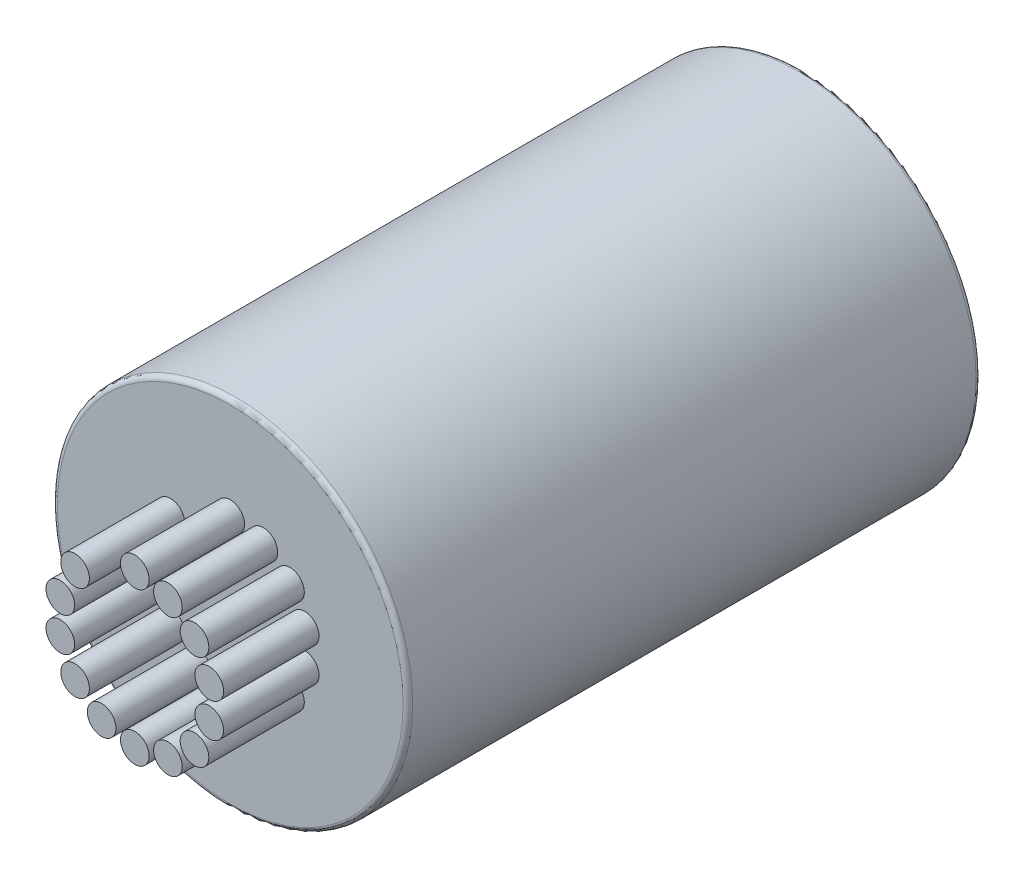
ISO-10303-21;
HEADER;
FILE_DESCRIPTION(('STEP AP214'),'2;1');
FILE_NAME('part.step','',(''),(''),'','','');
FILE_SCHEMA(('AUTOMOTIVE_DESIGN { 1 0 10303 214 1 1 1 1 }'));
ENDSEC;
DATA;
#1=APPLICATION_CONTEXT('core data for automotive mechanical design processes');
#2=APPLICATION_PROTOCOL_DEFINITION('international standard','automotive_design',2000,#1);
#3=PRODUCT_CONTEXT('',#1,'mechanical');
#4=PRODUCT('Part','Part','',(#3));
#5=PRODUCT_RELATED_PRODUCT_CATEGORY('part','',(#4));
#6=PRODUCT_DEFINITION_FORMATION('','',#4);
#7=PRODUCT_DEFINITION_CONTEXT('part definition',#1,'design');
#8=PRODUCT_DEFINITION('design','',#6,#7);
#9=PRODUCT_DEFINITION_SHAPE('','',#8);
#10=(LENGTH_UNIT() NAMED_UNIT(*) SI_UNIT(.MILLI.,.METRE.));
#11=(NAMED_UNIT(*) PLANE_ANGLE_UNIT() SI_UNIT($,.RADIAN.));
#12=(NAMED_UNIT(*) SI_UNIT($,.STERADIAN.) SOLID_ANGLE_UNIT());
#13=UNCERTAINTY_MEASURE_WITH_UNIT(LENGTH_MEASURE(1.E-05),#10,'distance_accuracy_value','');
#14=(GEOMETRIC_REPRESENTATION_CONTEXT(3) GLOBAL_UNCERTAINTY_ASSIGNED_CONTEXT((#13)) GLOBAL_UNIT_ASSIGNED_CONTEXT((#10,
#11,#12)) REPRESENTATION_CONTEXT('',''));
#15=CARTESIAN_POINT('',(0.,0.,0.));
#16=DIRECTION('',(0.,0.,1.));
#17=DIRECTION('',(1.,0.,0.));
#18=AXIS2_PLACEMENT_3D('',#15,#16,#17);
#19=CARTESIAN_POINT('',(0.,0.,30.));
#20=DIRECTION('',(0.,0.,-1.));
#21=DIRECTION('',(-1.,0.,0.));
#22=AXIS2_PLACEMENT_3D('',#19,#20,#21);
#23=CYLINDRICAL_SURFACE('',#22,9.3);
#24=CARTESIAN_POINT('',(0.,0.,29.75));
#25=DIRECTION('',(0.,0.,1.));
#26=DIRECTION('',(1.,0.,0.));
#27=AXIS2_PLACEMENT_3D('',#24,#25,#26);
#28=CIRCLE('',#27,9.3);
#29=CARTESIAN_POINT('',(9.3,0.,29.75));
#30=VERTEX_POINT('',#29);
#31=EDGE_CURVE('E39',#30,#30,#28,.F.);
#32=ORIENTED_EDGE('',*,*,#31,.T.);
#33=EDGE_LOOP('',(#32));
#34=FACE_BOUND('',#33,.T.);
#35=CARTESIAN_POINT('',(0.,0.,0.25));
#36=DIRECTION('',(0.,0.,1.));
#37=DIRECTION('',(1.,0.,0.));
#38=AXIS2_PLACEMENT_3D('',#35,#36,#37);
#39=CIRCLE('',#38,9.3);
#40=CARTESIAN_POINT('',(9.3,0.,0.25));
#41=VERTEX_POINT('',#40);
#42=EDGE_CURVE('E43',#41,#41,#39,.T.);
#43=ORIENTED_EDGE('',*,*,#42,.T.);
#44=EDGE_LOOP('',(#43));
#45=FACE_BOUND('',#44,.T.);
#46=ADVANCED_FACE('F32',(#34,#45),#23,.T.);
#47=CARTESIAN_POINT('',(0.,0.,30.));
#48=DIRECTION('',(0.,0.,1.));
#49=DIRECTION('',(1.,0.,0.));
#50=AXIS2_PLACEMENT_3D('',#47,#48,#49);
#51=PLANE('',#50);
#52=CARTESIAN_POINT('',(0.,0.,30.));
#53=DIRECTION('',(0.,0.,1.));
#54=DIRECTION('',(1.,0.,0.));
#55=AXIS2_PLACEMENT_3D('',#52,#53,#54);
#56=CIRCLE('',#55,9.05);
#57=CARTESIAN_POINT('',(9.05,0.,30.));
#58=VERTEX_POINT('',#57);
#59=EDGE_CURVE('E47',#58,#58,#56,.T.);
#60=ORIENTED_EDGE('',*,*,#59,.T.);
#61=EDGE_LOOP('',(#60));
#62=FACE_BOUND('',#61,.T.);
#63=CARTESIAN_POINT('',(-3.12732592987195,2.49395920743501,30.));
#64=DIRECTION('',(0.,0.,1.));
#65=DIRECTION('',(1.,0.,0.));
#66=AXIS2_PLACEMENT_3D('',#63,#64,#65);
#67=CIRCLE('',#66,0.750000000000115);
#68=CARTESIAN_POINT('',(-2.37732592987183,2.49395920743501,30.));
#69=VERTEX_POINT('',#68);
#70=EDGE_CURVE('E131',#69,#69,#67,.T.);
#71=ORIENTED_EDGE('',*,*,#70,.F.);
#72=EDGE_LOOP('',(#71));
#73=FACE_BOUND('',#72,.T.);
#74=CARTESIAN_POINT('',(-3.89971164872716,0.890083735825348,30.));
#75=DIRECTION('',(0.,0.,1.));
#76=DIRECTION('',(1.,0.,0.));
#77=AXIS2_PLACEMENT_3D('',#74,#75,#76);
#78=CIRCLE('',#77,0.750000000000158);
#79=CARTESIAN_POINT('',(-3.149711648727,0.890083735825348,30.));
#80=VERTEX_POINT('',#79);
#81=EDGE_CURVE('E125',#80,#80,#78,.T.);
#82=ORIENTED_EDGE('',*,*,#81,.F.);
#83=EDGE_LOOP('',(#82));
#84=FACE_BOUND('',#83,.T.);
#85=CARTESIAN_POINT('',(-3.8997116487272,-0.890083735825168,30.));
#86=DIRECTION('',(0.,0.,1.));
#87=DIRECTION('',(1.,0.,0.));
#88=AXIS2_PLACEMENT_3D('',#85,#86,#87);
#89=CIRCLE('',#88,0.750000000000203);
#90=CARTESIAN_POINT('',(-3.149711648727,-0.890083735825168,30.));
#91=VERTEX_POINT('',#90);
#92=EDGE_CURVE('E119',#91,#91,#89,.T.);
#93=ORIENTED_EDGE('',*,*,#92,.F.);
#94=EDGE_LOOP('',(#93));
#95=FACE_BOUND('',#94,.T.);
#96=CARTESIAN_POINT('',(-3.12732592987206,-2.49395920743486,30.));
#97=DIRECTION('',(0.,0.,1.));
#98=DIRECTION('',(1.,0.,0.));
#99=AXIS2_PLACEMENT_3D('',#96,#97,#98);
#100=CIRCLE('',#99,0.750000000000238);
#101=CARTESIAN_POINT('',(-2.37732592987182,-2.49395920743486,30.));
#102=VERTEX_POINT('',#101);
#103=EDGE_CURVE('E113',#102,#102,#100,.T.);
#104=ORIENTED_EDGE('',*,*,#103,.F.);
#105=EDGE_LOOP('',(#104));
#106=FACE_BOUND('',#105,.T.);
#107=CARTESIAN_POINT('',(-1.7355349564702,-3.60387547160964,30.));
#108=DIRECTION('',(0.,0.,1.));
#109=DIRECTION('',(1.,0.,0.));
#110=AXIS2_PLACEMENT_3D('',#107,#108,#109);
#111=CIRCLE('',#110,0.750000000000253);
#112=CARTESIAN_POINT('',(-0.985534956469948,-3.60387547160964,30.));
#113=VERTEX_POINT('',#112);
#114=EDGE_CURVE('E107',#113,#113,#111,.T.);
#115=ORIENTED_EDGE('',*,*,#114,.F.);
#116=EDGE_LOOP('',(#115));
#117=FACE_BOUND('',#116,.T.);
#118=CARTESIAN_POINT('',(0.,-4.,30.));
#119=DIRECTION('',(0.,0.,1.));
#120=DIRECTION('',(1.,0.,0.));
#121=AXIS2_PLACEMENT_3D('',#118,#119,#120);
#122=CIRCLE('',#121,0.750000000000246);
#123=CARTESIAN_POINT('',(0.750000000000268,-4.,30.));
#124=VERTEX_POINT('',#123);
#125=EDGE_CURVE('E101',#124,#124,#122,.T.);
#126=ORIENTED_EDGE('',*,*,#125,.F.);
#127=EDGE_LOOP('',(#126));
#128=FACE_BOUND('',#127,.T.);
#129=CARTESIAN_POINT('',(1.73553495647026,-3.60387547160972,30.));
#130=DIRECTION('',(0.,0.,1.));
#131=DIRECTION('',(1.,0.,0.));
#132=AXIS2_PLACEMENT_3D('',#129,#130,#131);
#133=CIRCLE('',#132,0.750000000000218);
#134=CARTESIAN_POINT('',(2.48553495647048,-3.60387547160972,30.));
#135=VERTEX_POINT('',#134);
#136=EDGE_CURVE('E95',#135,#135,#133,.T.);
#137=ORIENTED_EDGE('',*,*,#136,.F.);
#138=EDGE_LOOP('',(#137));
#139=FACE_BOUND('',#138,.T.);
#140=CARTESIAN_POINT('',(3.12732592987218,-2.49395920743501,30.));
#141=DIRECTION('',(0.,0.,1.));
#142=DIRECTION('',(1.,0.,0.));
#143=AXIS2_PLACEMENT_3D('',#140,#141,#142);
#144=CIRCLE('',#143,0.75000000000017);
#145=CARTESIAN_POINT('',(3.87732592987235,-2.49395920743501,30.));
#146=VERTEX_POINT('',#145);
#147=EDGE_CURVE('E89',#146,#146,#144,.T.);
#148=ORIENTED_EDGE('',*,*,#147,.F.);
#149=EDGE_LOOP('',(#148));
#150=FACE_BOUND('',#149,.T.);
#151=CARTESIAN_POINT('',(3.89971164872739,-0.890083735825348,30.));
#152=DIRECTION('',(0.,0.,1.));
#153=DIRECTION('',(1.,0.,0.));
#154=AXIS2_PLACEMENT_3D('',#151,#152,#153);
#155=CIRCLE('',#154,0.750000000000117);
#156=CARTESIAN_POINT('',(4.64971164872751,-0.890083735825348,30.));
#157=VERTEX_POINT('',#156);
#158=EDGE_CURVE('E83',#157,#157,#155,.T.);
#159=ORIENTED_EDGE('',*,*,#158,.F.);
#160=EDGE_LOOP('',(#159));
#161=FACE_BOUND('',#160,.T.);
#162=CARTESIAN_POINT('',(3.89971164872743,0.890083735825167,30.));
#163=DIRECTION('',(0.,0.,1.));
#164=DIRECTION('',(1.,0.,0.));
#165=AXIS2_PLACEMENT_3D('',#162,#163,#164);
#166=CIRCLE('',#165,0.750000000000064);
#167=CARTESIAN_POINT('',(4.64971164872749,0.890083735825167,30.));
#168=VERTEX_POINT('',#167);
#169=EDGE_CURVE('E77',#168,#168,#166,.T.);
#170=ORIENTED_EDGE('',*,*,#169,.F.);
#171=EDGE_LOOP('',(#170));
#172=FACE_BOUND('',#171,.T.);
#173=CARTESIAN_POINT('',(3.12732592987225,2.49395920743477,30.));
#174=DIRECTION('',(0.,0.,1.));
#175=DIRECTION('',(1.,0.,0.));
#176=AXIS2_PLACEMENT_3D('',#173,#174,#175);
#177=CIRCLE('',#176,0.75);
#178=CARTESIAN_POINT('',(3.87732592987225,2.49395920743477,30.));
#179=VERTEX_POINT('',#178);
#180=EDGE_CURVE('E71',#179,#179,#177,.T.);
#181=ORIENTED_EDGE('',*,*,#180,.F.);
#182=EDGE_LOOP('',(#181));
#183=FACE_BOUND('',#182,.T.);
#184=CARTESIAN_POINT('',(1.73553495647042,3.60387547160959,30.));
#185=DIRECTION('',(0.,0.,1.));
#186=DIRECTION('',(1.,0.,0.));
#187=AXIS2_PLACEMENT_3D('',#184,#185,#186);
#188=CIRCLE('',#187,0.75);
#189=CARTESIAN_POINT('',(2.48553495647042,3.60387547160959,30.));
#190=VERTEX_POINT('',#189);
#191=EDGE_CURVE('E65',#190,#190,#188,.T.);
#192=ORIENTED_EDGE('',*,*,#191,.F.);
#193=EDGE_LOOP('',(#192));
#194=FACE_BOUND('',#193,.T.);
#195=CARTESIAN_POINT('',(2.07662222155635E-13,4.,30.));
#196=DIRECTION('',(0.,0.,1.));
#197=DIRECTION('',(1.,0.,0.));
#198=AXIS2_PLACEMENT_3D('',#195,#196,#197);
#199=CIRCLE('',#198,0.75);
#200=CARTESIAN_POINT('',(0.750000000000208,4.,30.));
#201=VERTEX_POINT('',#200);
#202=EDGE_CURVE('E59',#201,#201,#199,.T.);
#203=ORIENTED_EDGE('',*,*,#202,.F.);
#204=EDGE_LOOP('',(#203));
#205=FACE_BOUND('',#204,.T.);
#206=ADVANCED_FACE('F146',(#62,#73,#84,#95,#106,#117,#128,#139,#150,#161,#172,#183,#194,#205),
#51,.T.);
#207=CARTESIAN_POINT('',(0.,0.,0.));
#208=DIRECTION('',(0.,0.,1.));
#209=DIRECTION('',(1.,0.,0.));
#210=AXIS2_PLACEMENT_3D('',#207,#208,#209);
#211=PLANE('',#210);
#212=CARTESIAN_POINT('',(0.,0.,0.));
#213=DIRECTION('',(0.,0.,1.));
#214=DIRECTION('',(1.,0.,0.));
#215=AXIS2_PLACEMENT_3D('',#212,#213,#214);
#216=CIRCLE('',#215,9.05);
#217=CARTESIAN_POINT('',(9.05,0.,0.));
#218=VERTEX_POINT('',#217);
#219=EDGE_CURVE('E10',#218,#218,#216,.F.);
#220=ORIENTED_EDGE('',*,*,#219,.T.);
#221=EDGE_LOOP('',(#220));
#222=FACE_BOUND('',#221,.T.);
#223=CARTESIAN_POINT('',(0.,0.,0.));
#224=DIRECTION('',(0.,0.,-1.));
#225=DIRECTION('',(-1.,0.,0.));
#226=AXIS2_PLACEMENT_3D('',#223,#224,#225);
#227=CIRCLE('',#226,7.5);
#228=CARTESIAN_POINT('',(-7.5,0.,0.));
#229=VERTEX_POINT('',#228);
#230=EDGE_CURVE('E53',#229,#229,#227,.T.);
#231=ORIENTED_EDGE('',*,*,#230,.F.);
#232=EDGE_LOOP('',(#231));
#233=FACE_BOUND('',#232,.T.);
#234=ADVANCED_FACE('F149',(#222,#233),#211,.F.);
#235=CARTESIAN_POINT('',(0.,0.,0.1));
#236=DIRECTION('',(0.,0.,-1.));
#237=DIRECTION('',(-1.,0.,0.));
#238=AXIS2_PLACEMENT_3D('',#235,#236,#237);
#239=CYLINDRICAL_SURFACE('',#238,7.5);
#240=CARTESIAN_POINT('',(0.,0.,0.1));
#241=DIRECTION('',(0.,0.,-1.));
#242=DIRECTION('',(-1.,0.,0.));
#243=AXIS2_PLACEMENT_3D('',#240,#241,#242);
#244=CIRCLE('',#243,7.5);
#245=CARTESIAN_POINT('',(-7.5,0.,0.1));
#246=VERTEX_POINT('',#245);
#247=EDGE_CURVE('E52',#246,#246,#244,.T.);
#248=ORIENTED_EDGE('',*,*,#247,.F.);
#249=EDGE_LOOP('',(#248));
#250=FACE_BOUND('',#249,.T.);
#251=ORIENTED_EDGE('',*,*,#230,.T.);
#252=EDGE_LOOP('',(#251));
#253=FACE_BOUND('',#252,.T.);
#254=ADVANCED_FACE('F189',(#250,#253),#239,.F.);
#255=CARTESIAN_POINT('',(0.,0.,0.1));
#256=DIRECTION('',(0.,0.,-1.));
#257=DIRECTION('',(-1.,0.,0.));
#258=AXIS2_PLACEMENT_3D('',#255,#256,#257);
#259=PLANE('',#258);
#260=ORIENTED_EDGE('',*,*,#247,.T.);
#261=EDGE_LOOP('',(#260));
#262=FACE_BOUND('',#261,.T.);
#263=ADVANCED_FACE('F179',(#262),#259,.T.);
#264=CARTESIAN_POINT('',(2.07662222155635E-13,4.,35.));
#265=DIRECTION('',(0.,0.,-1.));
#266=DIRECTION('',(-1.,0.,0.));
#267=AXIS2_PLACEMENT_3D('',#264,#265,#266);
#268=CYLINDRICAL_SURFACE('',#267,0.75);
#269=CARTESIAN_POINT('',(2.07662222155635E-13,4.,35.));
#270=DIRECTION('',(0.,0.,1.));
#271=DIRECTION('',(1.,0.,0.));
#272=AXIS2_PLACEMENT_3D('',#269,#270,#271);
#273=CIRCLE('',#272,0.75);
#274=CARTESIAN_POINT('',(0.750000000000208,4.,35.));
#275=VERTEX_POINT('',#274);
#276=EDGE_CURVE('E56',#275,#275,#273,.T.);
#277=ORIENTED_EDGE('',*,*,#276,.F.);
#278=EDGE_LOOP('',(#277));
#279=FACE_BOUND('',#278,.T.);
#280=ORIENTED_EDGE('',*,*,#202,.T.);
#281=EDGE_LOOP('',(#280));
#282=FACE_BOUND('',#281,.T.);
#283=ADVANCED_FACE('F176',(#279,#282),#268,.T.);
#284=CARTESIAN_POINT('',(2.07662222155635E-13,4.,35.));
#285=DIRECTION('',(0.,0.,1.));
#286=DIRECTION('',(1.,0.,0.));
#287=AXIS2_PLACEMENT_3D('',#284,#285,#286);
#288=PLANE('',#287);
#289=ORIENTED_EDGE('',*,*,#276,.T.);
#290=EDGE_LOOP('',(#289));
#291=FACE_BOUND('',#290,.T.);
#292=ADVANCED_FACE('F178',(#291),#288,.T.);
#293=CARTESIAN_POINT('',(1.73553495647042,3.60387547160959,35.));
#294=DIRECTION('',(0.,0.,-1.));
#295=DIRECTION('',(-1.,0.,0.));
#296=AXIS2_PLACEMENT_3D('',#293,#294,#295);
#297=CYLINDRICAL_SURFACE('',#296,0.75);
#298=CARTESIAN_POINT('',(1.73553495647042,3.60387547160959,35.));
#299=DIRECTION('',(0.,0.,1.));
#300=DIRECTION('',(1.,0.,0.));
#301=AXIS2_PLACEMENT_3D('',#298,#299,#300);
#302=CIRCLE('',#301,0.75);
#303=CARTESIAN_POINT('',(2.48553495647042,3.60387547160959,35.));
#304=VERTEX_POINT('',#303);
#305=EDGE_CURVE('E62',#304,#304,#302,.T.);
#306=ORIENTED_EDGE('',*,*,#305,.F.);
#307=EDGE_LOOP('',(#306));
#308=FACE_BOUND('',#307,.T.);
#309=ORIENTED_EDGE('',*,*,#191,.T.);
#310=EDGE_LOOP('',(#309));
#311=FACE_BOUND('',#310,.T.);
#312=ADVANCED_FACE('F186',(#308,#311),#297,.T.);
#313=CARTESIAN_POINT('',(1.73553495647042,3.60387547160959,35.));
#314=DIRECTION('',(0.,0.,1.));
#315=DIRECTION('',(1.,0.,0.));
#316=AXIS2_PLACEMENT_3D('',#313,#314,#315);
#317=PLANE('',#316);
#318=ORIENTED_EDGE('',*,*,#305,.T.);
#319=EDGE_LOOP('',(#318));
#320=FACE_BOUND('',#319,.T.);
#321=ADVANCED_FACE('F291',(#320),#317,.T.);
#322=CARTESIAN_POINT('',(3.12732592987225,2.49395920743477,35.));
#323=DIRECTION('',(0.,0.,-1.));
#324=DIRECTION('',(-1.,0.,0.));
#325=AXIS2_PLACEMENT_3D('',#322,#323,#324);
#326=CYLINDRICAL_SURFACE('',#325,0.75);
#327=CARTESIAN_POINT('',(3.12732592987225,2.49395920743477,35.));
#328=DIRECTION('',(0.,0.,1.));
#329=DIRECTION('',(1.,0.,0.));
#330=AXIS2_PLACEMENT_3D('',#327,#328,#329);
#331=CIRCLE('',#330,0.75);
#332=CARTESIAN_POINT('',(3.87732592987225,2.49395920743477,35.));
#333=VERTEX_POINT('',#332);
#334=EDGE_CURVE('E68',#333,#333,#331,.T.);
#335=ORIENTED_EDGE('',*,*,#334,.F.);
#336=EDGE_LOOP('',(#335));
#337=FACE_BOUND('',#336,.T.);
#338=ORIENTED_EDGE('',*,*,#180,.T.);
#339=EDGE_LOOP('',(#338));
#340=FACE_BOUND('',#339,.T.);
#341=ADVANCED_FACE('F287',(#337,#340),#326,.T.);
#342=CARTESIAN_POINT('',(3.12732592987225,2.49395920743477,35.));
#343=DIRECTION('',(0.,0.,1.));
#344=DIRECTION('',(1.,0.,0.));
#345=AXIS2_PLACEMENT_3D('',#342,#343,#344);
#346=PLANE('',#345);
#347=ORIENTED_EDGE('',*,*,#334,.T.);
#348=EDGE_LOOP('',(#347));
#349=FACE_BOUND('',#348,.T.);
#350=ADVANCED_FACE('F283',(#349),#346,.T.);
#351=CARTESIAN_POINT('',(3.89971164872743,0.890083735825167,35.));
#352=DIRECTION('',(0.,0.,-1.));
#353=DIRECTION('',(-1.,0.,0.));
#354=AXIS2_PLACEMENT_3D('',#351,#352,#353);
#355=CYLINDRICAL_SURFACE('',#354,0.750000000000064);
#356=CARTESIAN_POINT('',(3.89971164872743,0.890083735825167,35.));
#357=DIRECTION('',(0.,0.,1.));
#358=DIRECTION('',(1.,0.,0.));
#359=AXIS2_PLACEMENT_3D('',#356,#357,#358);
#360=CIRCLE('',#359,0.750000000000064);
#361=CARTESIAN_POINT('',(4.64971164872749,0.890083735825167,35.));
#362=VERTEX_POINT('',#361);
#363=EDGE_CURVE('E74',#362,#362,#360,.T.);
#364=ORIENTED_EDGE('',*,*,#363,.F.);
#365=EDGE_LOOP('',(#364));
#366=FACE_BOUND('',#365,.T.);
#367=ORIENTED_EDGE('',*,*,#169,.T.);
#368=EDGE_LOOP('',(#367));
#369=FACE_BOUND('',#368,.T.);
#370=ADVANCED_FACE('F279',(#366,#369),#355,.T.);
#371=CARTESIAN_POINT('',(3.89971164872743,0.890083735825167,35.));
#372=DIRECTION('',(0.,0.,1.));
#373=DIRECTION('',(1.,0.,0.));
#374=AXIS2_PLACEMENT_3D('',#371,#372,#373);
#375=PLANE('',#374);
#376=ORIENTED_EDGE('',*,*,#363,.T.);
#377=EDGE_LOOP('',(#376));
#378=FACE_BOUND('',#377,.T.);
#379=ADVANCED_FACE('F275',(#378),#375,.T.);
#380=CARTESIAN_POINT('',(3.89971164872739,-0.890083735825348,35.));
#381=DIRECTION('',(0.,0.,-1.));
#382=DIRECTION('',(-1.,0.,0.));
#383=AXIS2_PLACEMENT_3D('',#380,#381,#382);
#384=CYLINDRICAL_SURFACE('',#383,0.750000000000117);
#385=CARTESIAN_POINT('',(3.89971164872739,-0.890083735825348,35.));
#386=DIRECTION('',(0.,0.,1.));
#387=DIRECTION('',(1.,0.,0.));
#388=AXIS2_PLACEMENT_3D('',#385,#386,#387);
#389=CIRCLE('',#388,0.750000000000117);
#390=CARTESIAN_POINT('',(4.64971164872751,-0.890083735825348,35.));
#391=VERTEX_POINT('',#390);
#392=EDGE_CURVE('E80',#391,#391,#389,.T.);
#393=ORIENTED_EDGE('',*,*,#392,.F.);
#394=EDGE_LOOP('',(#393));
#395=FACE_BOUND('',#394,.T.);
#396=ORIENTED_EDGE('',*,*,#158,.T.);
#397=EDGE_LOOP('',(#396));
#398=FACE_BOUND('',#397,.T.);
#399=ADVANCED_FACE('F271',(#395,#398),#384,.T.);
#400=CARTESIAN_POINT('',(3.89971164872739,-0.890083735825348,35.));
#401=DIRECTION('',(0.,0.,1.));
#402=DIRECTION('',(1.,0.,0.));
#403=AXIS2_PLACEMENT_3D('',#400,#401,#402);
#404=PLANE('',#403);
#405=ORIENTED_EDGE('',*,*,#392,.T.);
#406=EDGE_LOOP('',(#405));
#407=FACE_BOUND('',#406,.T.);
#408=ADVANCED_FACE('F267',(#407),#404,.T.);
#409=CARTESIAN_POINT('',(3.12732592987218,-2.49395920743501,35.));
#410=DIRECTION('',(0.,0.,-1.));
#411=DIRECTION('',(-1.,0.,0.));
#412=AXIS2_PLACEMENT_3D('',#409,#410,#411);
#413=CYLINDRICAL_SURFACE('',#412,0.75000000000017);
#414=CARTESIAN_POINT('',(3.12732592987218,-2.49395920743501,35.));
#415=DIRECTION('',(0.,0.,1.));
#416=DIRECTION('',(1.,0.,0.));
#417=AXIS2_PLACEMENT_3D('',#414,#415,#416);
#418=CIRCLE('',#417,0.75000000000017);
#419=CARTESIAN_POINT('',(3.87732592987235,-2.49395920743501,35.));
#420=VERTEX_POINT('',#419);
#421=EDGE_CURVE('E86',#420,#420,#418,.T.);
#422=ORIENTED_EDGE('',*,*,#421,.F.);
#423=EDGE_LOOP('',(#422));
#424=FACE_BOUND('',#423,.T.);
#425=ORIENTED_EDGE('',*,*,#147,.T.);
#426=EDGE_LOOP('',(#425));
#427=FACE_BOUND('',#426,.T.);
#428=ADVANCED_FACE('F263',(#424,#427),#413,.T.);
#429=CARTESIAN_POINT('',(3.12732592987218,-2.49395920743501,35.));
#430=DIRECTION('',(0.,0.,1.));
#431=DIRECTION('',(1.,0.,0.));
#432=AXIS2_PLACEMENT_3D('',#429,#430,#431);
#433=PLANE('',#432);
#434=ORIENTED_EDGE('',*,*,#421,.T.);
#435=EDGE_LOOP('',(#434));
#436=FACE_BOUND('',#435,.T.);
#437=ADVANCED_FACE('F259',(#436),#433,.T.);
#438=CARTESIAN_POINT('',(1.73553495647026,-3.60387547160972,35.));
#439=DIRECTION('',(0.,0.,-1.));
#440=DIRECTION('',(-1.,0.,0.));
#441=AXIS2_PLACEMENT_3D('',#438,#439,#440);
#442=CYLINDRICAL_SURFACE('',#441,0.750000000000218);
#443=CARTESIAN_POINT('',(1.73553495647026,-3.60387547160972,35.));
#444=DIRECTION('',(0.,0.,1.));
#445=DIRECTION('',(1.,0.,0.));
#446=AXIS2_PLACEMENT_3D('',#443,#444,#445);
#447=CIRCLE('',#446,0.750000000000218);
#448=CARTESIAN_POINT('',(2.48553495647048,-3.60387547160972,35.));
#449=VERTEX_POINT('',#448);
#450=EDGE_CURVE('E92',#449,#449,#447,.T.);
#451=ORIENTED_EDGE('',*,*,#450,.F.);
#452=EDGE_LOOP('',(#451));
#453=FACE_BOUND('',#452,.T.);
#454=ORIENTED_EDGE('',*,*,#136,.T.);
#455=EDGE_LOOP('',(#454));
#456=FACE_BOUND('',#455,.T.);
#457=ADVANCED_FACE('F255',(#453,#456),#442,.T.);
#458=CARTESIAN_POINT('',(1.73553495647026,-3.60387547160972,35.));
#459=DIRECTION('',(0.,0.,1.));
#460=DIRECTION('',(1.,0.,0.));
#461=AXIS2_PLACEMENT_3D('',#458,#459,#460);
#462=PLANE('',#461);
#463=ORIENTED_EDGE('',*,*,#450,.T.);
#464=EDGE_LOOP('',(#463));
#465=FACE_BOUND('',#464,.T.);
#466=ADVANCED_FACE('F251',(#465),#462,.T.);
#467=CARTESIAN_POINT('',(0.,-4.,35.));
#468=DIRECTION('',(0.,0.,-1.));
#469=DIRECTION('',(-1.,0.,0.));
#470=AXIS2_PLACEMENT_3D('',#467,#468,#469);
#471=CYLINDRICAL_SURFACE('',#470,0.750000000000246);
#472=CARTESIAN_POINT('',(0.,-4.,35.));
#473=DIRECTION('',(0.,0.,1.));
#474=DIRECTION('',(1.,0.,0.));
#475=AXIS2_PLACEMENT_3D('',#472,#473,#474);
#476=CIRCLE('',#475,0.750000000000246);
#477=CARTESIAN_POINT('',(0.750000000000268,-4.,35.));
#478=VERTEX_POINT('',#477);
#479=EDGE_CURVE('E98',#478,#478,#476,.T.);
#480=ORIENTED_EDGE('',*,*,#479,.F.);
#481=EDGE_LOOP('',(#480));
#482=FACE_BOUND('',#481,.T.);
#483=ORIENTED_EDGE('',*,*,#125,.T.);
#484=EDGE_LOOP('',(#483));
#485=FACE_BOUND('',#484,.T.);
#486=ADVANCED_FACE('F247',(#482,#485),#471,.T.);
#487=CARTESIAN_POINT('',(0.,-4.,35.));
#488=DIRECTION('',(0.,0.,1.));
#489=DIRECTION('',(1.,0.,0.));
#490=AXIS2_PLACEMENT_3D('',#487,#488,#489);
#491=PLANE('',#490);
#492=ORIENTED_EDGE('',*,*,#479,.T.);
#493=EDGE_LOOP('',(#492));
#494=FACE_BOUND('',#493,.T.);
#495=ADVANCED_FACE('F243',(#494),#491,.T.);
#496=CARTESIAN_POINT('',(-1.7355349564702,-3.60387547160964,35.));
#497=DIRECTION('',(0.,0.,-1.));
#498=DIRECTION('',(-1.,0.,0.));
#499=AXIS2_PLACEMENT_3D('',#496,#497,#498);
#500=CYLINDRICAL_SURFACE('',#499,0.750000000000253);
#501=CARTESIAN_POINT('',(-1.7355349564702,-3.60387547160964,35.));
#502=DIRECTION('',(0.,0.,1.));
#503=DIRECTION('',(1.,0.,0.));
#504=AXIS2_PLACEMENT_3D('',#501,#502,#503);
#505=CIRCLE('',#504,0.750000000000253);
#506=CARTESIAN_POINT('',(-0.985534956469948,-3.60387547160964,35.));
#507=VERTEX_POINT('',#506);
#508=EDGE_CURVE('E104',#507,#507,#505,.T.);
#509=ORIENTED_EDGE('',*,*,#508,.F.);
#510=EDGE_LOOP('',(#509));
#511=FACE_BOUND('',#510,.T.);
#512=ORIENTED_EDGE('',*,*,#114,.T.);
#513=EDGE_LOOP('',(#512));
#514=FACE_BOUND('',#513,.T.);
#515=ADVANCED_FACE('F239',(#511,#514),#500,.T.);
#516=CARTESIAN_POINT('',(-1.7355349564702,-3.60387547160964,35.));
#517=DIRECTION('',(0.,0.,1.));
#518=DIRECTION('',(1.,0.,0.));
#519=AXIS2_PLACEMENT_3D('',#516,#517,#518);
#520=PLANE('',#519);
#521=ORIENTED_EDGE('',*,*,#508,.T.);
#522=EDGE_LOOP('',(#521));
#523=FACE_BOUND('',#522,.T.);
#524=ADVANCED_FACE('F235',(#523),#520,.T.);
#525=CARTESIAN_POINT('',(-3.12732592987206,-2.49395920743486,35.));
#526=DIRECTION('',(0.,0.,-1.));
#527=DIRECTION('',(-1.,0.,0.));
#528=AXIS2_PLACEMENT_3D('',#525,#526,#527);
#529=CYLINDRICAL_SURFACE('',#528,0.750000000000238);
#530=CARTESIAN_POINT('',(-3.12732592987206,-2.49395920743486,35.));
#531=DIRECTION('',(0.,0.,1.));
#532=DIRECTION('',(1.,0.,0.));
#533=AXIS2_PLACEMENT_3D('',#530,#531,#532);
#534=CIRCLE('',#533,0.750000000000238);
#535=CARTESIAN_POINT('',(-2.37732592987182,-2.49395920743486,35.));
#536=VERTEX_POINT('',#535);
#537=EDGE_CURVE('E110',#536,#536,#534,.T.);
#538=ORIENTED_EDGE('',*,*,#537,.F.);
#539=EDGE_LOOP('',(#538));
#540=FACE_BOUND('',#539,.T.);
#541=ORIENTED_EDGE('',*,*,#103,.T.);
#542=EDGE_LOOP('',(#541));
#543=FACE_BOUND('',#542,.T.);
#544=ADVANCED_FACE('F231',(#540,#543),#529,.T.);
#545=CARTESIAN_POINT('',(-3.12732592987206,-2.49395920743486,35.));
#546=DIRECTION('',(0.,0.,1.));
#547=DIRECTION('',(1.,0.,0.));
#548=AXIS2_PLACEMENT_3D('',#545,#546,#547);
#549=PLANE('',#548);
#550=ORIENTED_EDGE('',*,*,#537,.T.);
#551=EDGE_LOOP('',(#550));
#552=FACE_BOUND('',#551,.T.);
#553=ADVANCED_FACE('F227',(#552),#549,.T.);
#554=CARTESIAN_POINT('',(-3.8997116487272,-0.890083735825168,35.));
#555=DIRECTION('',(0.,0.,-1.));
#556=DIRECTION('',(-1.,0.,0.));
#557=AXIS2_PLACEMENT_3D('',#554,#555,#556);
#558=CYLINDRICAL_SURFACE('',#557,0.750000000000203);
#559=CARTESIAN_POINT('',(-3.8997116487272,-0.890083735825168,35.));
#560=DIRECTION('',(0.,0.,1.));
#561=DIRECTION('',(1.,0.,0.));
#562=AXIS2_PLACEMENT_3D('',#559,#560,#561);
#563=CIRCLE('',#562,0.750000000000203);
#564=CARTESIAN_POINT('',(-3.149711648727,-0.890083735825168,35.));
#565=VERTEX_POINT('',#564);
#566=EDGE_CURVE('E116',#565,#565,#563,.T.);
#567=ORIENTED_EDGE('',*,*,#566,.F.);
#568=EDGE_LOOP('',(#567));
#569=FACE_BOUND('',#568,.T.);
#570=ORIENTED_EDGE('',*,*,#92,.T.);
#571=EDGE_LOOP('',(#570));
#572=FACE_BOUND('',#571,.T.);
#573=ADVANCED_FACE('F223',(#569,#572),#558,.T.);
#574=CARTESIAN_POINT('',(-3.8997116487272,-0.890083735825168,35.));
#575=DIRECTION('',(0.,0.,1.));
#576=DIRECTION('',(1.,0.,0.));
#577=AXIS2_PLACEMENT_3D('',#574,#575,#576);
#578=PLANE('',#577);
#579=ORIENTED_EDGE('',*,*,#566,.T.);
#580=EDGE_LOOP('',(#579));
#581=FACE_BOUND('',#580,.T.);
#582=ADVANCED_FACE('F219',(#581),#578,.T.);
#583=CARTESIAN_POINT('',(-3.89971164872716,0.890083735825348,35.));
#584=DIRECTION('',(0.,0.,-1.));
#585=DIRECTION('',(-1.,0.,0.));
#586=AXIS2_PLACEMENT_3D('',#583,#584,#585);
#587=CYLINDRICAL_SURFACE('',#586,0.750000000000158);
#588=CARTESIAN_POINT('',(-3.89971164872716,0.890083735825348,35.));
#589=DIRECTION('',(0.,0.,1.));
#590=DIRECTION('',(1.,0.,0.));
#591=AXIS2_PLACEMENT_3D('',#588,#589,#590);
#592=CIRCLE('',#591,0.750000000000158);
#593=CARTESIAN_POINT('',(-3.149711648727,0.890083735825348,35.));
#594=VERTEX_POINT('',#593);
#595=EDGE_CURVE('E122',#594,#594,#592,.T.);
#596=ORIENTED_EDGE('',*,*,#595,.F.);
#597=EDGE_LOOP('',(#596));
#598=FACE_BOUND('',#597,.T.);
#599=ORIENTED_EDGE('',*,*,#81,.T.);
#600=EDGE_LOOP('',(#599));
#601=FACE_BOUND('',#600,.T.);
#602=ADVANCED_FACE('F215',(#598,#601),#587,.T.);
#603=CARTESIAN_POINT('',(-3.89971164872716,0.890083735825348,35.));
#604=DIRECTION('',(0.,0.,1.));
#605=DIRECTION('',(1.,0.,0.));
#606=AXIS2_PLACEMENT_3D('',#603,#604,#605);
#607=PLANE('',#606);
#608=ORIENTED_EDGE('',*,*,#595,.T.);
#609=EDGE_LOOP('',(#608));
#610=FACE_BOUND('',#609,.T.);
#611=ADVANCED_FACE('F142',(#610),#607,.T.);
#612=CARTESIAN_POINT('',(-3.12732592987195,2.49395920743501,35.));
#613=DIRECTION('',(0.,0.,-1.));
#614=DIRECTION('',(-1.,0.,0.));
#615=AXIS2_PLACEMENT_3D('',#612,#613,#614);
#616=CYLINDRICAL_SURFACE('',#615,0.750000000000115);
#617=CARTESIAN_POINT('',(-3.12732592987195,2.49395920743501,35.));
#618=DIRECTION('',(0.,0.,1.));
#619=DIRECTION('',(1.,0.,0.));
#620=AXIS2_PLACEMENT_3D('',#617,#618,#619);
#621=CIRCLE('',#620,0.750000000000115);
#622=CARTESIAN_POINT('',(-2.37732592987183,2.49395920743501,35.));
#623=VERTEX_POINT('',#622);
#624=EDGE_CURVE('E128',#623,#623,#621,.T.);
#625=ORIENTED_EDGE('',*,*,#624,.F.);
#626=EDGE_LOOP('',(#625));
#627=FACE_BOUND('',#626,.T.);
#628=ORIENTED_EDGE('',*,*,#70,.T.);
#629=EDGE_LOOP('',(#628));
#630=FACE_BOUND('',#629,.T.);
#631=ADVANCED_FACE('F139',(#627,#630),#616,.T.);
#632=CARTESIAN_POINT('',(-3.12732592987195,2.49395920743501,35.));
#633=DIRECTION('',(0.,0.,1.));
#634=DIRECTION('',(1.,0.,0.));
#635=AXIS2_PLACEMENT_3D('',#632,#633,#634);
#636=PLANE('',#635);
#637=ORIENTED_EDGE('',*,*,#624,.T.);
#638=EDGE_LOOP('',(#637));
#639=FACE_BOUND('',#638,.T.);
#640=ADVANCED_FACE('F137',(#639),#636,.T.);
#641=CARTESIAN_POINT('',(0.,0.,29.75));
#642=DIRECTION('',(0.,0.,1.));
#643=DIRECTION('',(1.,0.,0.));
#644=AXIS2_PLACEMENT_3D('',#641,#642,#643);
#645=TOROIDAL_SURFACE('',#644,9.05,0.25);
#646=ORIENTED_EDGE('',*,*,#31,.F.);
#647=EDGE_LOOP('',(#646));
#648=FACE_BOUND('',#647,.T.);
#649=ORIENTED_EDGE('',*,*,#59,.F.);
#650=EDGE_LOOP('',(#649));
#651=FACE_BOUND('',#650,.T.);
#652=ADVANCED_FACE('F199',(#648,#651),#645,.T.);
#653=CARTESIAN_POINT('',(0.,0.,0.25));
#654=DIRECTION('',(0.,0.,1.));
#655=DIRECTION('',(1.,0.,0.));
#656=AXIS2_PLACEMENT_3D('',#653,#654,#655);
#657=TOROIDAL_SURFACE('',#656,9.05,0.25);
#658=ORIENTED_EDGE('',*,*,#219,.F.);
#659=EDGE_LOOP('',(#658));
#660=FACE_BOUND('',#659,.T.);
#661=ORIENTED_EDGE('',*,*,#42,.F.);
#662=EDGE_LOOP('',(#661));
#663=FACE_BOUND('',#662,.T.);
#664=ADVANCED_FACE('F34',(#660,#663),#657,.T.);
#665=CLOSED_SHELL('',(#46,#206,#234,#254,#263,#283,#292,#312,#321,#341,#350,#370,#379,#399,#408,
#428,#437,#457,#466,#486,#495,#515,#524,#544,#553,#573,#582,#602,#611,#631,#640,#652,#664));
#666=MANIFOLD_SOLID_BREP('B2',#665);
#667=ADVANCED_BREP_SHAPE_REPRESENTATION('',(#18,#666),#14);
#668=SHAPE_DEFINITION_REPRESENTATION(#9,#667);
ENDSEC;
END-ISO-10303-21;
